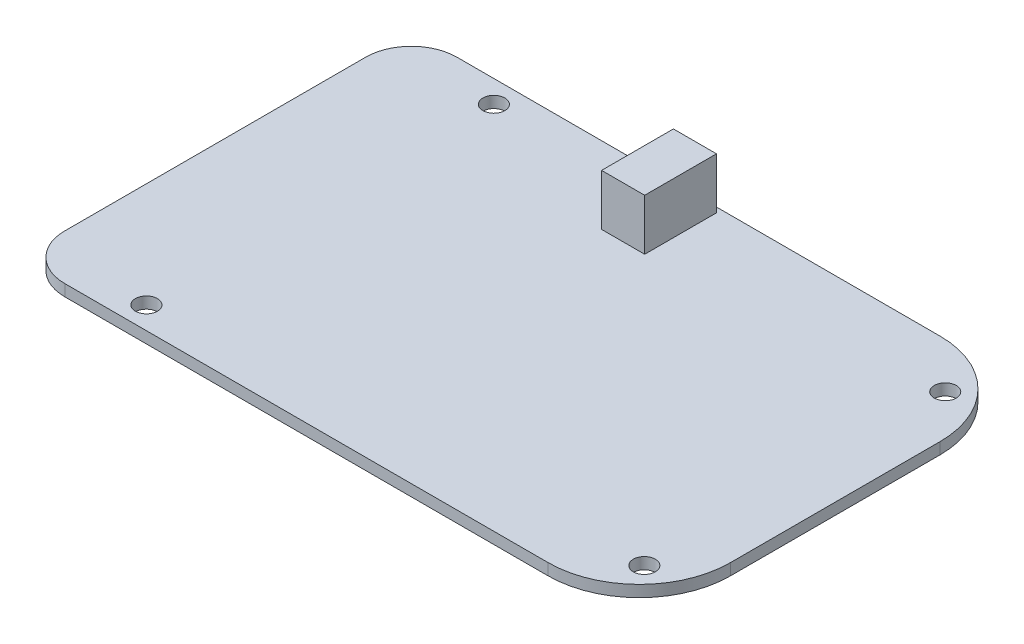
ISO-10303-21;
HEADER;
FILE_DESCRIPTION(('STEP AP214'),'2;1');
FILE_NAME('part.step','',(''),(''),'','','');
FILE_SCHEMA(('AUTOMOTIVE_DESIGN { 1 0 10303 214 1 1 1 1 }'));
ENDSEC;
DATA;
#1=APPLICATION_CONTEXT('core data for automotive mechanical design processes');
#2=APPLICATION_PROTOCOL_DEFINITION('international standard','automotive_design',2000,#1);
#3=PRODUCT_CONTEXT('',#1,'mechanical');
#4=PRODUCT('Part','Part','',(#3));
#5=PRODUCT_RELATED_PRODUCT_CATEGORY('part','',(#4));
#6=PRODUCT_DEFINITION_FORMATION('','',#4);
#7=PRODUCT_DEFINITION_CONTEXT('part definition',#1,'design');
#8=PRODUCT_DEFINITION('design','',#6,#7);
#9=PRODUCT_DEFINITION_SHAPE('','',#8);
#10=(LENGTH_UNIT() NAMED_UNIT(*) SI_UNIT(.MILLI.,.METRE.));
#11=(NAMED_UNIT(*) PLANE_ANGLE_UNIT() SI_UNIT($,.RADIAN.));
#12=(NAMED_UNIT(*) SI_UNIT($,.STERADIAN.) SOLID_ANGLE_UNIT());
#13=UNCERTAINTY_MEASURE_WITH_UNIT(LENGTH_MEASURE(1.E-05),#10,'distance_accuracy_value','');
#14=(GEOMETRIC_REPRESENTATION_CONTEXT(3) GLOBAL_UNCERTAINTY_ASSIGNED_CONTEXT((#13)) GLOBAL_UNIT_ASSIGNED_CONTEXT((#10,
#11,#12)) REPRESENTATION_CONTEXT('',''));
#15=CARTESIAN_POINT('',(0.,0.,0.));
#16=DIRECTION('',(0.,0.,1.));
#17=DIRECTION('',(1.,0.,0.));
#18=AXIS2_PLACEMENT_3D('',#15,#16,#17);
#19=CARTESIAN_POINT('',(6.35,0.,-48.26));
#20=DIRECTION('',(0.,1.,0.));
#21=DIRECTION('',(0.,0.,1.));
#22=AXIS2_PLACEMENT_3D('',#19,#20,#21);
#23=PLANE('',#22);
#24=DIRECTION('',(0.,0.,1.));
#25=VECTOR('',#24,1.);
#26=CARTESIAN_POINT('',(50.3,0.,-52.76));
#27=LINE('',#26,#25);
#28=CARTESIAN_POINT('',(50.3,0.,-52.76));
#29=VERTEX_POINT('',#28);
#30=CARTESIAN_POINT('',(50.3,0.,-46.01));
#31=VERTEX_POINT('',#30);
#32=EDGE_CURVE('E238',#29,#31,#27,.T.);
#33=ORIENTED_EDGE('',*,*,#32,.F.);
#34=DIRECTION('',(1.,0.,0.));
#35=VECTOR('',#34,1.);
#36=CARTESIAN_POINT('',(44.,0.,-52.76));
#37=LINE('',#36,#35);
#38=CARTESIAN_POINT('',(44.,0.,-52.76));
#39=VERTEX_POINT('',#38);
#40=EDGE_CURVE('E251',#39,#29,#37,.T.);
#41=ORIENTED_EDGE('',*,*,#40,.F.);
#42=DIRECTION('',(0.,0.,-1.));
#43=VECTOR('',#42,1.);
#44=CARTESIAN_POINT('',(44.,0.,-46.01));
#45=LINE('',#44,#43);
#46=CARTESIAN_POINT('',(44.,0.,-46.01));
#47=VERTEX_POINT('',#46);
#48=EDGE_CURVE('E260',#47,#39,#45,.T.);
#49=ORIENTED_EDGE('',*,*,#48,.F.);
#50=DIRECTION('',(-1.,0.,0.));
#51=VECTOR('',#50,1.);
#52=CARTESIAN_POINT('',(50.3,0.,-46.01));
#53=LINE('',#52,#51);
#54=EDGE_CURVE('E241',#31,#47,#53,.T.);
#55=ORIENTED_EDGE('',*,*,#54,.F.);
#56=EDGE_LOOP('',(#33,#41,#49,#55));
#57=FACE_BOUND('',#56,.T.);
#58=DIRECTION('',(1.,0.,0.));
#59=VECTOR('',#58,1.);
#60=CARTESIAN_POINT('',(15.3,0.,-32.));
#61=LINE('',#60,#59);
#62=CARTESIAN_POINT('',(0.,0.,-32.));
#63=VERTEX_POINT('',#62);
#64=CARTESIAN_POINT('',(15.3,0.,-32.));
#65=VERTEX_POINT('',#64);
#66=EDGE_CURVE('E314',#63,#65,#61,.T.);
#67=ORIENTED_EDGE('',*,*,#66,.F.);
#68=DIRECTION('',(0.,0.,1.));
#69=VECTOR('',#68,1.);
#70=CARTESIAN_POINT('',(0.,0.,-48.26));
#71=LINE('',#70,#69);
#72=CARTESIAN_POINT('',(0.,0.,-48.26));
#73=VERTEX_POINT('',#72);
#74=EDGE_CURVE('E415',#73,#63,#71,.T.);
#75=ORIENTED_EDGE('',*,*,#74,.F.);
#76=CARTESIAN_POINT('',(6.35,0.,-48.26));
#77=DIRECTION('',(0.,1.,0.));
#78=DIRECTION('',(0.,0.,1.));
#79=AXIS2_PLACEMENT_3D('',#76,#77,#78);
#80=CIRCLE('',#79,6.35);
#81=CARTESIAN_POINT('',(6.35,0.,-54.61));
#82=VERTEX_POINT('',#81);
#83=EDGE_CURVE('E390',#82,#73,#80,.T.);
#84=ORIENTED_EDGE('',*,*,#83,.F.);
#85=DIRECTION('',(-1.,0.,0.));
#86=VECTOR('',#85,1.);
#87=CARTESIAN_POINT('',(6.35,0.,-54.61));
#88=LINE('',#87,#86);
#89=CARTESIAN_POINT('',(73.66,0.,-54.61));
#90=VERTEX_POINT('',#89);
#91=EDGE_CURVE('E397',#90,#82,#88,.T.);
#92=ORIENTED_EDGE('',*,*,#91,.F.);
#93=CARTESIAN_POINT('',(73.66,0.,-41.91));
#94=DIRECTION('',(0.,1.,0.));
#95=DIRECTION('',(0.,0.,-1.));
#96=AXIS2_PLACEMENT_3D('',#93,#94,#95);
#97=CIRCLE('',#96,12.7);
#98=CARTESIAN_POINT('',(86.36,0.,-41.91));
#99=VERTEX_POINT('',#98);
#100=EDGE_CURVE('E426',#99,#90,#97,.T.);
#101=ORIENTED_EDGE('',*,*,#100,.F.);
#102=DIRECTION('',(0.,0.,-1.));
#103=VECTOR('',#102,1.);
#104=CARTESIAN_POINT('',(86.36,0.,-12.7));
#105=LINE('',#104,#103);
#106=CARTESIAN_POINT('',(86.36,0.,-12.7));
#107=VERTEX_POINT('',#106);
#108=EDGE_CURVE('E424',#107,#99,#105,.T.);
#109=ORIENTED_EDGE('',*,*,#108,.F.);
#110=CARTESIAN_POINT('',(73.66,0.,-12.7));
#111=DIRECTION('',(0.,1.,0.));
#112=DIRECTION('',(0.,0.,1.));
#113=AXIS2_PLACEMENT_3D('',#110,#111,#112);
#114=CIRCLE('',#113,12.7);
#115=CARTESIAN_POINT('',(73.66,0.,0.));
#116=VERTEX_POINT('',#115);
#117=EDGE_CURVE('E422',#116,#107,#114,.T.);
#118=ORIENTED_EDGE('',*,*,#117,.F.);
#119=DIRECTION('',(1.,0.,0.));
#120=VECTOR('',#119,1.);
#121=CARTESIAN_POINT('',(6.34999999999999,0.,0.));
#122=LINE('',#121,#120);
#123=CARTESIAN_POINT('',(6.34999999999999,0.,0.));
#124=VERTEX_POINT('',#123);
#125=EDGE_CURVE('E420',#124,#116,#122,.T.);
#126=ORIENTED_EDGE('',*,*,#125,.F.);
#127=CARTESIAN_POINT('',(6.34999999999999,0.,-6.35));
#128=DIRECTION('',(0.,1.,0.));
#129=DIRECTION('',(0.,0.,1.));
#130=AXIS2_PLACEMENT_3D('',#127,#128,#129);
#131=CIRCLE('',#130,6.35);
#132=CARTESIAN_POINT('',(0.,0.,-6.35));
#133=VERTEX_POINT('',#132);
#134=EDGE_CURVE('E418',#133,#124,#131,.T.);
#135=ORIENTED_EDGE('',*,*,#134,.F.);
#136=CARTESIAN_POINT('',(0.,0.,-18.));
#137=VERTEX_POINT('',#136);
#138=EDGE_CURVE('E414',#137,#133,#71,.T.);
#139=ORIENTED_EDGE('',*,*,#138,.F.);
#140=DIRECTION('',(-1.,0.,0.));
#141=VECTOR('',#140,1.);
#142=CARTESIAN_POINT('',(15.3,0.,-18.));
#143=LINE('',#142,#141);
#144=CARTESIAN_POINT('',(15.3,0.,-18.));
#145=VERTEX_POINT('',#144);
#146=EDGE_CURVE('E323',#145,#137,#143,.T.);
#147=ORIENTED_EDGE('',*,*,#146,.F.);
#148=DIRECTION('',(0.,0.,1.));
#149=VECTOR('',#148,1.);
#150=CARTESIAN_POINT('',(15.3,0.,-32.));
#151=LINE('',#150,#149);
#152=EDGE_CURVE('E309',#65,#145,#151,.T.);
#153=ORIENTED_EDGE('',*,*,#152,.F.);
#154=EDGE_LOOP('',(#67,#75,#84,#92,#101,#109,#118,#126,#135,#139,#147,#153));
#155=FACE_BOUND('',#154,.T.);
#156=CARTESIAN_POINT('',(14.61,0.,-3.10999999999999));
#157=DIRECTION('',(0.,1.,0.));
#158=DIRECTION('',(0.,0.,1.));
#159=AXIS2_PLACEMENT_3D('',#156,#157,#158);
#160=CIRCLE('',#159,1.53);
#161=CARTESIAN_POINT('',(14.61,0.,-1.57999999999999));
#162=VERTEX_POINT('',#161);
#163=EDGE_CURVE('E369',#162,#162,#160,.T.);
#164=ORIENTED_EDGE('',*,*,#163,.T.);
#165=EDGE_LOOP('',(#164));
#166=FACE_BOUND('',#165,.T.);
#167=CARTESIAN_POINT('',(14.61,0.,-51.5));
#168=DIRECTION('',(0.,1.,0.));
#169=DIRECTION('',(0.,0.,1.));
#170=AXIS2_PLACEMENT_3D('',#167,#168,#169);
#171=CIRCLE('',#170,1.53);
#172=CARTESIAN_POINT('',(14.61,0.,-49.97));
#173=VERTEX_POINT('',#172);
#174=EDGE_CURVE('E376',#173,#173,#171,.T.);
#175=ORIENTED_EDGE('',*,*,#174,.T.);
#176=EDGE_LOOP('',(#175));
#177=FACE_BOUND('',#176,.T.);
#178=CARTESIAN_POINT('',(80.71,0.,-48.26));
#179=DIRECTION('',(0.,1.,0.));
#180=DIRECTION('',(0.,0.,1.));
#181=AXIS2_PLACEMENT_3D('',#178,#179,#180);
#182=CIRCLE('',#181,1.53);
#183=CARTESIAN_POINT('',(80.71,0.,-46.73));
#184=VERTEX_POINT('',#183);
#185=EDGE_CURVE('E382',#184,#184,#182,.T.);
#186=ORIENTED_EDGE('',*,*,#185,.T.);
#187=EDGE_LOOP('',(#186));
#188=FACE_BOUND('',#187,.T.);
#189=CARTESIAN_POINT('',(80.71,0.,-6.35));
#190=DIRECTION('',(0.,1.,0.));
#191=DIRECTION('',(0.,0.,1.));
#192=AXIS2_PLACEMENT_3D('',#189,#190,#191);
#193=CIRCLE('',#192,1.53);
#194=CARTESIAN_POINT('',(80.71,0.,-4.82));
#195=VERTEX_POINT('',#194);
#196=EDGE_CURVE('E387',#195,#195,#193,.T.);
#197=ORIENTED_EDGE('',*,*,#196,.T.);
#198=EDGE_LOOP('',(#197));
#199=FACE_BOUND('',#198,.T.);
#200=DIRECTION('',(-1.,0.,0.));
#201=VECTOR('',#200,1.);
#202=CARTESIAN_POINT('',(19.3,0.,-43.61));
#203=LINE('',#202,#201);
#204=CARTESIAN_POINT('',(25.3,0.,-43.61));
#205=VERTEX_POINT('',#204);
#206=CARTESIAN_POINT('',(19.3,0.,-43.61));
#207=VERTEX_POINT('',#206);
#208=EDGE_CURVE('E276',#205,#207,#203,.T.);
#209=ORIENTED_EDGE('',*,*,#208,.F.);
#210=DIRECTION('',(0.,0.,1.));
#211=VECTOR('',#210,1.);
#212=CARTESIAN_POINT('',(25.3,0.,-43.61));
#213=LINE('',#212,#211);
#214=CARTESIAN_POINT('',(25.3,0.,-50.61));
#215=VERTEX_POINT('',#214);
#216=EDGE_CURVE('E281',#215,#205,#213,.T.);
#217=ORIENTED_EDGE('',*,*,#216,.F.);
#218=DIRECTION('',(1.,0.,0.));
#219=VECTOR('',#218,1.);
#220=CARTESIAN_POINT('',(25.3,0.,-50.61));
#221=LINE('',#220,#219);
#222=CARTESIAN_POINT('',(19.3,0.,-50.61));
#223=VERTEX_POINT('',#222);
#224=EDGE_CURVE('E293',#223,#215,#221,.T.);
#225=ORIENTED_EDGE('',*,*,#224,.F.);
#226=DIRECTION('',(0.,0.,-1.));
#227=VECTOR('',#226,1.);
#228=CARTESIAN_POINT('',(19.3,0.,-50.61));
#229=LINE('',#228,#227);
#230=EDGE_CURVE('E290',#207,#223,#229,.T.);
#231=ORIENTED_EDGE('',*,*,#230,.F.);
#232=EDGE_LOOP('',(#209,#217,#225,#231));
#233=FACE_BOUND('',#232,.T.);
#234=DIRECTION('',(0.,0.,-1.));
#235=VECTOR('',#234,1.);
#236=CARTESIAN_POINT('',(57.36,0.,-44.41));
#237=LINE('',#236,#235);
#238=CARTESIAN_POINT('',(57.36,0.,-44.41));
#239=VERTEX_POINT('',#238);
#240=CARTESIAN_POINT('',(57.36,0.,-52.91));
#241=VERTEX_POINT('',#240);
#242=EDGE_CURVE('E237',#239,#241,#237,.T.);
#243=ORIENTED_EDGE('',*,*,#242,.F.);
#244=DIRECTION('',(-1.,0.,0.));
#245=VECTOR('',#244,1.);
#246=CARTESIAN_POINT('',(65.86,0.,-44.41));
#247=LINE('',#246,#245);
#248=CARTESIAN_POINT('',(65.86,0.,-44.41));
#249=VERTEX_POINT('',#248);
#250=EDGE_CURVE('E234',#249,#239,#247,.T.);
#251=ORIENTED_EDGE('',*,*,#250,.F.);
#252=DIRECTION('',(0.,0.,1.));
#253=VECTOR('',#252,1.);
#254=CARTESIAN_POINT('',(65.86,0.,-52.91));
#255=LINE('',#254,#253);
#256=CARTESIAN_POINT('',(65.86,0.,-52.91));
#257=VERTEX_POINT('',#256);
#258=EDGE_CURVE('E52',#257,#249,#255,.T.);
#259=ORIENTED_EDGE('',*,*,#258,.F.);
#260=DIRECTION('',(1.,0.,0.));
#261=VECTOR('',#260,1.);
#262=CARTESIAN_POINT('',(57.36,0.,-52.91));
#263=LINE('',#262,#261);
#264=EDGE_CURVE('E47',#241,#257,#263,.T.);
#265=ORIENTED_EDGE('',*,*,#264,.F.);
#266=EDGE_LOOP('',(#243,#251,#259,#265));
#267=FACE_BOUND('',#266,.T.);
#268=ADVANCED_FACE('F32',(#57,#155,#166,#177,#188,#199,#233,#267),#23,.F.);
#269=CARTESIAN_POINT('',(6.35,1.6,-48.26));
#270=DIRECTION('',(0.,1.,0.));
#271=DIRECTION('',(0.,0.,1.));
#272=AXIS2_PLACEMENT_3D('',#269,#270,#271);
#273=PLANE('',#272);
#274=CARTESIAN_POINT('',(14.61,1.6,-3.10999999999999));
#275=DIRECTION('',(0.,1.,0.));
#276=DIRECTION('',(0.,0.,1.));
#277=AXIS2_PLACEMENT_3D('',#274,#275,#276);
#278=CIRCLE('',#277,1.53);
#279=CARTESIAN_POINT('',(14.61,1.6,-1.57999999999999));
#280=VERTEX_POINT('',#279);
#281=EDGE_CURVE('E373',#280,#280,#278,.T.);
#282=ORIENTED_EDGE('',*,*,#281,.F.);
#283=EDGE_LOOP('',(#282));
#284=FACE_BOUND('',#283,.T.);
#285=CARTESIAN_POINT('',(14.61,1.6,-51.5));
#286=DIRECTION('',(0.,1.,0.));
#287=DIRECTION('',(0.,0.,1.));
#288=AXIS2_PLACEMENT_3D('',#285,#286,#287);
#289=CIRCLE('',#288,1.53);
#290=CARTESIAN_POINT('',(14.61,1.6,-49.97));
#291=VERTEX_POINT('',#290);
#292=EDGE_CURVE('E379',#291,#291,#289,.T.);
#293=ORIENTED_EDGE('',*,*,#292,.F.);
#294=EDGE_LOOP('',(#293));
#295=FACE_BOUND('',#294,.T.);
#296=CARTESIAN_POINT('',(80.71,1.6,-48.26));
#297=DIRECTION('',(0.,1.,0.));
#298=DIRECTION('',(0.,0.,1.));
#299=AXIS2_PLACEMENT_3D('',#296,#297,#298);
#300=CIRCLE('',#299,1.53);
#301=CARTESIAN_POINT('',(80.71,1.6,-46.73));
#302=VERTEX_POINT('',#301);
#303=EDGE_CURVE('E368',#302,#302,#300,.T.);
#304=ORIENTED_EDGE('',*,*,#303,.F.);
#305=EDGE_LOOP('',(#304));
#306=FACE_BOUND('',#305,.T.);
#307=CARTESIAN_POINT('',(80.71,1.6,-6.35));
#308=DIRECTION('',(0.,1.,0.));
#309=DIRECTION('',(0.,0.,1.));
#310=AXIS2_PLACEMENT_3D('',#307,#308,#309);
#311=CIRCLE('',#310,1.53);
#312=CARTESIAN_POINT('',(80.71,1.6,-4.82));
#313=VERTEX_POINT('',#312);
#314=EDGE_CURVE('E372',#313,#313,#311,.T.);
#315=ORIENTED_EDGE('',*,*,#314,.F.);
#316=EDGE_LOOP('',(#315));
#317=FACE_BOUND('',#316,.T.);
#318=CARTESIAN_POINT('',(6.35,1.6,-48.26));
#319=DIRECTION('',(0.,1.,0.));
#320=DIRECTION('',(0.,0.,1.));
#321=AXIS2_PLACEMENT_3D('',#318,#319,#320);
#322=CIRCLE('',#321,6.35);
#323=CARTESIAN_POINT('',(6.35,1.6,-54.61));
#324=VERTEX_POINT('',#323);
#325=CARTESIAN_POINT('',(0.,1.6,-48.26));
#326=VERTEX_POINT('',#325);
#327=EDGE_CURVE('E393',#324,#326,#322,.T.);
#328=ORIENTED_EDGE('',*,*,#327,.T.);
#329=DIRECTION('',(0.,0.,1.));
#330=VECTOR('',#329,1.);
#331=CARTESIAN_POINT('',(0.,1.6,-48.26));
#332=LINE('',#331,#330);
#333=CARTESIAN_POINT('',(0.,1.6,-6.35));
#334=VERTEX_POINT('',#333);
#335=EDGE_CURVE('E396',#326,#334,#332,.T.);
#336=ORIENTED_EDGE('',*,*,#335,.T.);
#337=CARTESIAN_POINT('',(6.34999999999999,1.6,-6.35));
#338=DIRECTION('',(0.,1.,0.));
#339=DIRECTION('',(0.,0.,1.));
#340=AXIS2_PLACEMENT_3D('',#337,#338,#339);
#341=CIRCLE('',#340,6.35);
#342=CARTESIAN_POINT('',(6.34999999999999,1.6,0.));
#343=VERTEX_POINT('',#342);
#344=EDGE_CURVE('E399',#334,#343,#341,.T.);
#345=ORIENTED_EDGE('',*,*,#344,.T.);
#346=DIRECTION('',(1.,0.,0.));
#347=VECTOR('',#346,1.);
#348=CARTESIAN_POINT('',(6.34999999999999,1.6,0.));
#349=LINE('',#348,#347);
#350=CARTESIAN_POINT('',(73.66,1.6,0.));
#351=VERTEX_POINT('',#350);
#352=EDGE_CURVE('E401',#343,#351,#349,.T.);
#353=ORIENTED_EDGE('',*,*,#352,.T.);
#354=CARTESIAN_POINT('',(73.66,1.6,-12.7));
#355=DIRECTION('',(0.,1.,0.));
#356=DIRECTION('',(0.,0.,1.));
#357=AXIS2_PLACEMENT_3D('',#354,#355,#356);
#358=CIRCLE('',#357,12.7);
#359=CARTESIAN_POINT('',(86.36,1.6,-12.7));
#360=VERTEX_POINT('',#359);
#361=EDGE_CURVE('E403',#351,#360,#358,.T.);
#362=ORIENTED_EDGE('',*,*,#361,.T.);
#363=DIRECTION('',(0.,0.,-1.));
#364=VECTOR('',#363,1.);
#365=CARTESIAN_POINT('',(86.36,1.6,-12.7));
#366=LINE('',#365,#364);
#367=CARTESIAN_POINT('',(86.36,1.6,-41.91));
#368=VERTEX_POINT('',#367);
#369=EDGE_CURVE('E405',#360,#368,#366,.T.);
#370=ORIENTED_EDGE('',*,*,#369,.T.);
#371=CARTESIAN_POINT('',(73.66,1.6,-41.91));
#372=DIRECTION('',(0.,1.,0.));
#373=DIRECTION('',(0.,0.,-1.));
#374=AXIS2_PLACEMENT_3D('',#371,#372,#373);
#375=CIRCLE('',#374,12.7);
#376=CARTESIAN_POINT('',(73.66,1.6,-54.61));
#377=VERTEX_POINT('',#376);
#378=EDGE_CURVE('E407',#368,#377,#375,.T.);
#379=ORIENTED_EDGE('',*,*,#378,.T.);
#380=DIRECTION('',(-1.,0.,0.));
#381=VECTOR('',#380,1.);
#382=CARTESIAN_POINT('',(6.35,1.6,-54.61));
#383=LINE('',#382,#381);
#384=EDGE_CURVE('E409',#377,#324,#383,.T.);
#385=ORIENTED_EDGE('',*,*,#384,.T.);
#386=EDGE_LOOP('',(#328,#336,#345,#353,#362,#370,#379,#385));
#387=FACE_BOUND('',#386,.T.);
#388=DIRECTION('',(1.,0.,0.));
#389=VECTOR('',#388,1.);
#390=CARTESIAN_POINT('',(37.2,1.6,-43.91));
#391=LINE('',#390,#389);
#392=CARTESIAN_POINT('',(37.2,1.6,-43.91));
#393=VERTEX_POINT('',#392);
#394=CARTESIAN_POINT('',(43.2,1.6,-43.91));
#395=VERTEX_POINT('',#394);
#396=EDGE_CURVE('E353',#393,#395,#391,.T.);
#397=ORIENTED_EDGE('',*,*,#396,.F.);
#398=DIRECTION('',(0.,0.,1.));
#399=VECTOR('',#398,1.);
#400=CARTESIAN_POINT('',(37.2,1.6,-53.91));
#401=LINE('',#400,#399);
#402=CARTESIAN_POINT('',(37.2,1.6,-53.91));
#403=VERTEX_POINT('',#402);
#404=EDGE_CURVE('E339',#403,#393,#401,.T.);
#405=ORIENTED_EDGE('',*,*,#404,.F.);
#406=DIRECTION('',(-1.,0.,0.));
#407=VECTOR('',#406,1.);
#408=CARTESIAN_POINT('',(43.2,1.6,-53.91));
#409=LINE('',#408,#407);
#410=CARTESIAN_POINT('',(43.2,1.6,-53.91));
#411=VERTEX_POINT('',#410);
#412=EDGE_CURVE('E344',#411,#403,#409,.T.);
#413=ORIENTED_EDGE('',*,*,#412,.F.);
#414=DIRECTION('',(0.,0.,-1.));
#415=VECTOR('',#414,1.);
#416=CARTESIAN_POINT('',(43.2,1.6,-43.91));
#417=LINE('',#416,#415);
#418=EDGE_CURVE('E355',#395,#411,#417,.T.);
#419=ORIENTED_EDGE('',*,*,#418,.F.);
#420=EDGE_LOOP('',(#397,#405,#413,#419));
#421=FACE_BOUND('',#420,.T.);
#422=ADVANCED_FACE('F468',(#284,#295,#306,#317,#387,#421),#273,.T.);
#423=CARTESIAN_POINT('',(6.35,1.6,-48.26));
#424=DIRECTION('',(0.,-1.,0.));
#425=DIRECTION('',(0.,0.,-1.));
#426=AXIS2_PLACEMENT_3D('',#423,#424,#425);
#427=CYLINDRICAL_SURFACE('',#426,6.35);
#428=ORIENTED_EDGE('',*,*,#83,.T.);
#429=DIRECTION('',(0.,-1.,0.));
#430=VECTOR('',#429,1.);
#431=CARTESIAN_POINT('',(0.,1.6,-48.26));
#432=LINE('',#431,#430);
#433=EDGE_CURVE('E11',#326,#73,#432,.T.);
#434=ORIENTED_EDGE('',*,*,#433,.F.);
#435=ORIENTED_EDGE('',*,*,#327,.F.);
#436=DIRECTION('',(0.,-1.,0.));
#437=VECTOR('',#436,1.);
#438=CARTESIAN_POINT('',(6.35,1.6,-54.61));
#439=LINE('',#438,#437);
#440=EDGE_CURVE('E411',#324,#82,#439,.T.);
#441=ORIENTED_EDGE('',*,*,#440,.T.);
#442=EDGE_LOOP('',(#428,#434,#435,#441));
#443=FACE_BOUND('',#442,.T.);
#444=ADVANCED_FACE('F34',(#443),#427,.T.);
#445=CARTESIAN_POINT('',(0.,1.6,-48.26));
#446=DIRECTION('',(1.,0.,0.));
#447=DIRECTION('',(0.,0.,-1.));
#448=AXIS2_PLACEMENT_3D('',#445,#446,#447);
#449=PLANE('',#448);
#450=ORIENTED_EDGE('',*,*,#74,.T.);
#451=DIRECTION('',(0.,1.,0.));
#452=VECTOR('',#451,1.);
#453=CARTESIAN_POINT('',(0.,-1.7,-32.));
#454=LINE('',#453,#452);
#455=CARTESIAN_POINT('',(0.,-1.7,-32.));
#456=VERTEX_POINT('',#455);
#457=EDGE_CURVE('E330',#456,#63,#454,.T.);
#458=ORIENTED_EDGE('',*,*,#457,.F.);
#459=DIRECTION('',(0.,0.,-1.));
#460=VECTOR('',#459,1.);
#461=CARTESIAN_POINT('',(0.,-1.7,-18.));
#462=LINE('',#461,#460);
#463=CARTESIAN_POINT('',(0.,-1.7,-18.));
#464=VERTEX_POINT('',#463);
#465=EDGE_CURVE('E316',#464,#456,#462,.T.);
#466=ORIENTED_EDGE('',*,*,#465,.F.);
#467=DIRECTION('',(0.,1.,0.));
#468=VECTOR('',#467,1.);
#469=CARTESIAN_POINT('',(0.,-1.7,-18.));
#470=LINE('',#469,#468);
#471=EDGE_CURVE('E333',#464,#137,#470,.T.);
#472=ORIENTED_EDGE('',*,*,#471,.T.);
#473=ORIENTED_EDGE('',*,*,#138,.T.);
#474=DIRECTION('',(0.,-1.,0.));
#475=VECTOR('',#474,1.);
#476=CARTESIAN_POINT('',(0.,1.6,-6.35));
#477=LINE('',#476,#475);
#478=EDGE_CURVE('E40',#334,#133,#477,.T.);
#479=ORIENTED_EDGE('',*,*,#478,.F.);
#480=ORIENTED_EDGE('',*,*,#335,.F.);
#481=ORIENTED_EDGE('',*,*,#433,.T.);
#482=EDGE_LOOP('',(#450,#458,#466,#472,#473,#479,#480,#481));
#483=FACE_BOUND('',#482,.T.);
#484=ADVANCED_FACE('F473',(#483),#449,.F.);
#485=CARTESIAN_POINT('',(6.34999999999999,1.6,-6.35));
#486=DIRECTION('',(0.,-1.,0.));
#487=DIRECTION('',(0.,0.,-1.));
#488=AXIS2_PLACEMENT_3D('',#485,#486,#487);
#489=CYLINDRICAL_SURFACE('',#488,6.35);
#490=ORIENTED_EDGE('',*,*,#134,.T.);
#491=DIRECTION('',(0.,-1.,0.));
#492=VECTOR('',#491,1.);
#493=CARTESIAN_POINT('',(6.34999999999999,1.6,0.));
#494=LINE('',#493,#492);
#495=EDGE_CURVE('E443',#343,#124,#494,.T.);
#496=ORIENTED_EDGE('',*,*,#495,.F.);
#497=ORIENTED_EDGE('',*,*,#344,.F.);
#498=ORIENTED_EDGE('',*,*,#478,.T.);
#499=EDGE_LOOP('',(#490,#496,#497,#498));
#500=FACE_BOUND('',#499,.T.);
#501=ADVANCED_FACE('F450',(#500),#489,.T.);
#502=CARTESIAN_POINT('',(6.34999999999999,1.6,0.));
#503=DIRECTION('',(0.,0.,-1.));
#504=DIRECTION('',(-1.,0.,0.));
#505=AXIS2_PLACEMENT_3D('',#502,#503,#504);
#506=PLANE('',#505);
#507=ORIENTED_EDGE('',*,*,#125,.T.);
#508=DIRECTION('',(0.,-1.,0.));
#509=VECTOR('',#508,1.);
#510=CARTESIAN_POINT('',(73.66,1.6,0.));
#511=LINE('',#510,#509);
#512=EDGE_CURVE('E440',#351,#116,#511,.T.);
#513=ORIENTED_EDGE('',*,*,#512,.F.);
#514=ORIENTED_EDGE('',*,*,#352,.F.);
#515=ORIENTED_EDGE('',*,*,#495,.T.);
#516=EDGE_LOOP('',(#507,#513,#514,#515));
#517=FACE_BOUND('',#516,.T.);
#518=ADVANCED_FACE('F460',(#517),#506,.F.);
#519=CARTESIAN_POINT('',(73.66,1.6,-12.7));
#520=DIRECTION('',(0.,-1.,0.));
#521=DIRECTION('',(0.,0.,-1.));
#522=AXIS2_PLACEMENT_3D('',#519,#520,#521);
#523=CYLINDRICAL_SURFACE('',#522,12.7);
#524=ORIENTED_EDGE('',*,*,#117,.T.);
#525=DIRECTION('',(0.,-1.,0.));
#526=VECTOR('',#525,1.);
#527=CARTESIAN_POINT('',(86.36,1.6,-12.7));
#528=LINE('',#527,#526);
#529=EDGE_CURVE('E437',#360,#107,#528,.T.);
#530=ORIENTED_EDGE('',*,*,#529,.F.);
#531=ORIENTED_EDGE('',*,*,#361,.F.);
#532=ORIENTED_EDGE('',*,*,#512,.T.);
#533=EDGE_LOOP('',(#524,#530,#531,#532));
#534=FACE_BOUND('',#533,.T.);
#535=ADVANCED_FACE('F464',(#534),#523,.T.);
#536=CARTESIAN_POINT('',(86.36,1.6,-12.7));
#537=DIRECTION('',(-1.,0.,0.));
#538=DIRECTION('',(0.,0.,1.));
#539=AXIS2_PLACEMENT_3D('',#536,#537,#538);
#540=PLANE('',#539);
#541=ORIENTED_EDGE('',*,*,#108,.T.);
#542=DIRECTION('',(0.,-1.,0.));
#543=VECTOR('',#542,1.);
#544=CARTESIAN_POINT('',(86.36,1.6,-41.91));
#545=LINE('',#544,#543);
#546=EDGE_CURVE('E434',#368,#99,#545,.T.);
#547=ORIENTED_EDGE('',*,*,#546,.F.);
#548=ORIENTED_EDGE('',*,*,#369,.F.);
#549=ORIENTED_EDGE('',*,*,#529,.T.);
#550=EDGE_LOOP('',(#541,#547,#548,#549));
#551=FACE_BOUND('',#550,.T.);
#552=ADVANCED_FACE('F521',(#551),#540,.F.);
#553=CARTESIAN_POINT('',(73.66,1.6,-41.91));
#554=DIRECTION('',(0.,-1.,0.));
#555=DIRECTION('',(0.,0.,-1.));
#556=AXIS2_PLACEMENT_3D('',#553,#554,#555);
#557=CYLINDRICAL_SURFACE('',#556,12.7);
#558=ORIENTED_EDGE('',*,*,#100,.T.);
#559=DIRECTION('',(0.,-1.,0.));
#560=VECTOR('',#559,1.);
#561=CARTESIAN_POINT('',(73.66,1.6,-54.61));
#562=LINE('',#561,#560);
#563=EDGE_CURVE('E431',#377,#90,#562,.T.);
#564=ORIENTED_EDGE('',*,*,#563,.F.);
#565=ORIENTED_EDGE('',*,*,#378,.F.);
#566=ORIENTED_EDGE('',*,*,#546,.T.);
#567=EDGE_LOOP('',(#558,#564,#565,#566));
#568=FACE_BOUND('',#567,.T.);
#569=ADVANCED_FACE('F517',(#568),#557,.T.);
#570=CARTESIAN_POINT('',(6.35,1.6,-54.61));
#571=DIRECTION('',(0.,0.,1.));
#572=DIRECTION('',(1.,0.,0.));
#573=AXIS2_PLACEMENT_3D('',#570,#571,#572);
#574=PLANE('',#573);
#575=ORIENTED_EDGE('',*,*,#91,.T.);
#576=ORIENTED_EDGE('',*,*,#440,.F.);
#577=ORIENTED_EDGE('',*,*,#384,.F.);
#578=ORIENTED_EDGE('',*,*,#563,.T.);
#579=EDGE_LOOP('',(#575,#576,#577,#578));
#580=FACE_BOUND('',#579,.T.);
#581=ADVANCED_FACE('F513',(#580),#574,.F.);
#582=CARTESIAN_POINT('',(80.71,0.,-6.35));
#583=DIRECTION('',(0.,1.,0.));
#584=DIRECTION('',(0.,0.,1.));
#585=AXIS2_PLACEMENT_3D('',#582,#583,#584);
#586=CYLINDRICAL_SURFACE('',#585,1.53);
#587=ORIENTED_EDGE('',*,*,#196,.F.);
#588=EDGE_LOOP('',(#587));
#589=FACE_BOUND('',#588,.T.);
#590=ORIENTED_EDGE('',*,*,#314,.T.);
#591=EDGE_LOOP('',(#590));
#592=FACE_BOUND('',#591,.T.);
#593=ADVANCED_FACE('F516',(#589,#592),#586,.F.);
#594=CARTESIAN_POINT('',(80.71,0.,-48.26));
#595=DIRECTION('',(0.,1.,0.));
#596=DIRECTION('',(0.,0.,1.));
#597=AXIS2_PLACEMENT_3D('',#594,#595,#596);
#598=CYLINDRICAL_SURFACE('',#597,1.53);
#599=ORIENTED_EDGE('',*,*,#185,.F.);
#600=EDGE_LOOP('',(#599));
#601=FACE_BOUND('',#600,.T.);
#602=ORIENTED_EDGE('',*,*,#303,.T.);
#603=EDGE_LOOP('',(#602));
#604=FACE_BOUND('',#603,.T.);
#605=ADVANCED_FACE('F843',(#601,#604),#598,.F.);
#606=CARTESIAN_POINT('',(14.61,0.,-51.5));
#607=DIRECTION('',(0.,1.,0.));
#608=DIRECTION('',(0.,0.,1.));
#609=AXIS2_PLACEMENT_3D('',#606,#607,#608);
#610=CYLINDRICAL_SURFACE('',#609,1.53);
#611=ORIENTED_EDGE('',*,*,#174,.F.);
#612=EDGE_LOOP('',(#611));
#613=FACE_BOUND('',#612,.T.);
#614=ORIENTED_EDGE('',*,*,#292,.T.);
#615=EDGE_LOOP('',(#614));
#616=FACE_BOUND('',#615,.T.);
#617=ADVANCED_FACE('F851',(#613,#616),#610,.F.);
#618=CARTESIAN_POINT('',(14.61,0.,-3.10999999999999));
#619=DIRECTION('',(0.,1.,0.));
#620=DIRECTION('',(0.,0.,1.));
#621=AXIS2_PLACEMENT_3D('',#618,#619,#620);
#622=CYLINDRICAL_SURFACE('',#621,1.53);
#623=ORIENTED_EDGE('',*,*,#163,.F.);
#624=EDGE_LOOP('',(#623));
#625=FACE_BOUND('',#624,.T.);
#626=ORIENTED_EDGE('',*,*,#281,.T.);
#627=EDGE_LOOP('',(#626));
#628=FACE_BOUND('',#627,.T.);
#629=ADVANCED_FACE('F550',(#625,#628),#622,.F.);
#630=CARTESIAN_POINT('',(37.2,8.72,-53.91));
#631=DIRECTION('',(1.,0.,0.));
#632=DIRECTION('',(0.,0.,-1.));
#633=AXIS2_PLACEMENT_3D('',#630,#631,#632);
#634=PLANE('',#633);
#635=ORIENTED_EDGE('',*,*,#404,.T.);
#636=DIRECTION('',(0.,-1.,0.));
#637=VECTOR('',#636,1.);
#638=CARTESIAN_POINT('',(37.2,8.72,-43.91));
#639=LINE('',#638,#637);
#640=CARTESIAN_POINT('',(37.2,8.72,-43.91));
#641=VERTEX_POINT('',#640);
#642=EDGE_CURVE('E366',#641,#393,#639,.T.);
#643=ORIENTED_EDGE('',*,*,#642,.F.);
#644=DIRECTION('',(0.,0.,1.));
#645=VECTOR('',#644,1.);
#646=CARTESIAN_POINT('',(37.2,8.72,-53.91));
#647=LINE('',#646,#645);
#648=CARTESIAN_POINT('',(37.2,8.72,-53.91));
#649=VERTEX_POINT('',#648);
#650=EDGE_CURVE('E340',#649,#641,#647,.T.);
#651=ORIENTED_EDGE('',*,*,#650,.F.);
#652=DIRECTION('',(0.,-1.,0.));
#653=VECTOR('',#652,1.);
#654=CARTESIAN_POINT('',(37.2,8.72,-53.91));
#655=LINE('',#654,#653);
#656=EDGE_CURVE('E350',#649,#403,#655,.T.);
#657=ORIENTED_EDGE('',*,*,#656,.T.);
#658=EDGE_LOOP('',(#635,#643,#651,#657));
#659=FACE_BOUND('',#658,.T.);
#660=ADVANCED_FACE('F554',(#659),#634,.F.);
#661=CARTESIAN_POINT('',(37.2,8.72,-43.91));
#662=DIRECTION('',(0.,0.,-1.));
#663=DIRECTION('',(-1.,0.,0.));
#664=AXIS2_PLACEMENT_3D('',#661,#662,#663);
#665=PLANE('',#664);
#666=ORIENTED_EDGE('',*,*,#396,.T.);
#667=DIRECTION('',(0.,-1.,0.));
#668=VECTOR('',#667,1.);
#669=CARTESIAN_POINT('',(43.2,8.72,-43.91));
#670=LINE('',#669,#668);
#671=CARTESIAN_POINT('',(43.2,8.72,-43.91));
#672=VERTEX_POINT('',#671);
#673=EDGE_CURVE('E363',#672,#395,#670,.T.);
#674=ORIENTED_EDGE('',*,*,#673,.F.);
#675=DIRECTION('',(1.,0.,0.));
#676=VECTOR('',#675,1.);
#677=CARTESIAN_POINT('',(37.2,8.72,-43.91));
#678=LINE('',#677,#676);
#679=EDGE_CURVE('E343',#641,#672,#678,.T.);
#680=ORIENTED_EDGE('',*,*,#679,.F.);
#681=ORIENTED_EDGE('',*,*,#642,.T.);
#682=EDGE_LOOP('',(#666,#674,#680,#681));
#683=FACE_BOUND('',#682,.T.);
#684=ADVANCED_FACE('F558',(#683),#665,.F.);
#685=CARTESIAN_POINT('',(43.2,8.72,-43.91));
#686=DIRECTION('',(-1.,0.,0.));
#687=DIRECTION('',(0.,0.,1.));
#688=AXIS2_PLACEMENT_3D('',#685,#686,#687);
#689=PLANE('',#688);
#690=ORIENTED_EDGE('',*,*,#418,.T.);
#691=DIRECTION('',(0.,-1.,0.));
#692=VECTOR('',#691,1.);
#693=CARTESIAN_POINT('',(43.2,8.72,-53.91));
#694=LINE('',#693,#692);
#695=CARTESIAN_POINT('',(43.2,8.72,-53.91));
#696=VERTEX_POINT('',#695);
#697=EDGE_CURVE('E361',#696,#411,#694,.T.);
#698=ORIENTED_EDGE('',*,*,#697,.F.);
#699=DIRECTION('',(0.,0.,-1.));
#700=VECTOR('',#699,1.);
#701=CARTESIAN_POINT('',(43.2,8.72,-43.91));
#702=LINE('',#701,#700);
#703=EDGE_CURVE('E346',#672,#696,#702,.T.);
#704=ORIENTED_EDGE('',*,*,#703,.F.);
#705=ORIENTED_EDGE('',*,*,#673,.T.);
#706=EDGE_LOOP('',(#690,#698,#704,#705));
#707=FACE_BOUND('',#706,.T.);
#708=ADVANCED_FACE('F568',(#707),#689,.F.);
#709=CARTESIAN_POINT('',(43.2,8.72,-53.91));
#710=DIRECTION('',(0.,0.,1.));
#711=DIRECTION('',(1.,0.,0.));
#712=AXIS2_PLACEMENT_3D('',#709,#710,#711);
#713=PLANE('',#712);
#714=ORIENTED_EDGE('',*,*,#412,.T.);
#715=ORIENTED_EDGE('',*,*,#656,.F.);
#716=DIRECTION('',(-1.,0.,0.));
#717=VECTOR('',#716,1.);
#718=CARTESIAN_POINT('',(43.2,8.72,-53.91));
#719=LINE('',#718,#717);
#720=EDGE_CURVE('E348',#696,#649,#719,.T.);
#721=ORIENTED_EDGE('',*,*,#720,.F.);
#722=ORIENTED_EDGE('',*,*,#697,.T.);
#723=EDGE_LOOP('',(#714,#715,#721,#722));
#724=FACE_BOUND('',#723,.T.);
#725=ADVANCED_FACE('F578',(#724),#713,.F.);
#726=CARTESIAN_POINT('',(0.,8.72,0.));
#727=DIRECTION('',(0.,1.,0.));
#728=DIRECTION('',(0.,0.,1.));
#729=AXIS2_PLACEMENT_3D('',#726,#727,#728);
#730=PLANE('',#729);
#731=ORIENTED_EDGE('',*,*,#650,.T.);
#732=ORIENTED_EDGE('',*,*,#679,.T.);
#733=ORIENTED_EDGE('',*,*,#703,.T.);
#734=ORIENTED_EDGE('',*,*,#720,.T.);
#735=EDGE_LOOP('',(#731,#732,#733,#734));
#736=FACE_BOUND('',#735,.T.);
#737=ADVANCED_FACE('F501',(#736),#730,.T.);
#738=CARTESIAN_POINT('',(15.3,-1.7,-32.));
#739=DIRECTION('',(-1.,0.,0.));
#740=DIRECTION('',(0.,0.,1.));
#741=AXIS2_PLACEMENT_3D('',#738,#739,#740);
#742=PLANE('',#741);
#743=ORIENTED_EDGE('',*,*,#152,.T.);
#744=DIRECTION('',(0.,1.,0.));
#745=VECTOR('',#744,1.);
#746=CARTESIAN_POINT('',(15.3,-1.7,-18.));
#747=LINE('',#746,#745);
#748=CARTESIAN_POINT('',(15.3,-1.7,-18.));
#749=VERTEX_POINT('',#748);
#750=EDGE_CURVE('E336',#749,#145,#747,.T.);
#751=ORIENTED_EDGE('',*,*,#750,.F.);
#752=DIRECTION('',(0.,0.,1.));
#753=VECTOR('',#752,1.);
#754=CARTESIAN_POINT('',(15.3,-1.7,-32.));
#755=LINE('',#754,#753);
#756=CARTESIAN_POINT('',(15.3,-1.7,-32.));
#757=VERTEX_POINT('',#756);
#758=EDGE_CURVE('E310',#757,#749,#755,.T.);
#759=ORIENTED_EDGE('',*,*,#758,.F.);
#760=DIRECTION('',(0.,1.,0.));
#761=VECTOR('',#760,1.);
#762=CARTESIAN_POINT('',(15.3,-1.7,-32.));
#763=LINE('',#762,#761);
#764=EDGE_CURVE('E320',#757,#65,#763,.T.);
#765=ORIENTED_EDGE('',*,*,#764,.T.);
#766=EDGE_LOOP('',(#743,#751,#759,#765));
#767=FACE_BOUND('',#766,.T.);
#768=ADVANCED_FACE('F486',(#767),#742,.F.);
#769=CARTESIAN_POINT('',(15.3,-1.7,-18.));
#770=DIRECTION('',(0.,0.,-1.));
#771=DIRECTION('',(-1.,0.,0.));
#772=AXIS2_PLACEMENT_3D('',#769,#770,#771);
#773=PLANE('',#772);
#774=ORIENTED_EDGE('',*,*,#146,.T.);
#775=ORIENTED_EDGE('',*,*,#471,.F.);
#776=DIRECTION('',(-1.,0.,0.));
#777=VECTOR('',#776,1.);
#778=CARTESIAN_POINT('',(15.3,-1.7,-18.));
#779=LINE('',#778,#777);
#780=EDGE_CURVE('E313',#749,#464,#779,.T.);
#781=ORIENTED_EDGE('',*,*,#780,.F.);
#782=ORIENTED_EDGE('',*,*,#750,.T.);
#783=EDGE_LOOP('',(#774,#775,#781,#782));
#784=FACE_BOUND('',#783,.T.);
#785=ADVANCED_FACE('F493',(#784),#773,.F.);
#786=CARTESIAN_POINT('',(15.3,-1.7,-32.));
#787=DIRECTION('',(0.,0.,1.));
#788=DIRECTION('',(1.,0.,0.));
#789=AXIS2_PLACEMENT_3D('',#786,#787,#788);
#790=PLANE('',#789);
#791=ORIENTED_EDGE('',*,*,#66,.T.);
#792=ORIENTED_EDGE('',*,*,#764,.F.);
#793=DIRECTION('',(1.,0.,0.));
#794=VECTOR('',#793,1.);
#795=CARTESIAN_POINT('',(15.3,-1.7,-32.));
#796=LINE('',#795,#794);
#797=EDGE_CURVE('E318',#456,#757,#796,.T.);
#798=ORIENTED_EDGE('',*,*,#797,.F.);
#799=ORIENTED_EDGE('',*,*,#457,.T.);
#800=EDGE_LOOP('',(#791,#792,#798,#799));
#801=FACE_BOUND('',#800,.T.);
#802=ADVANCED_FACE('F482',(#801),#790,.F.);
#803=CARTESIAN_POINT('',(0.,-1.7,0.));
#804=DIRECTION('',(0.,-1.,0.));
#805=DIRECTION('',(0.,0.,-1.));
#806=AXIS2_PLACEMENT_3D('',#803,#804,#805);
#807=PLANE('',#806);
#808=ORIENTED_EDGE('',*,*,#758,.T.);
#809=ORIENTED_EDGE('',*,*,#780,.T.);
#810=ORIENTED_EDGE('',*,*,#465,.T.);
#811=ORIENTED_EDGE('',*,*,#797,.T.);
#812=EDGE_LOOP('',(#808,#809,#810,#811));
#813=FACE_BOUND('',#812,.T.);
#814=ADVANCED_FACE('F489',(#813),#807,.T.);
#815=CARTESIAN_POINT('',(19.3,-4.6,-43.61));
#816=DIRECTION('',(0.,0.,-1.));
#817=DIRECTION('',(-1.,0.,0.));
#818=AXIS2_PLACEMENT_3D('',#815,#816,#817);
#819=PLANE('',#818);
#820=ORIENTED_EDGE('',*,*,#208,.T.);
#821=DIRECTION('',(0.,1.,0.));
#822=VECTOR('',#821,1.);
#823=CARTESIAN_POINT('',(19.3,-4.6,-43.61));
#824=LINE('',#823,#822);
#825=CARTESIAN_POINT('',(19.3,-4.6,-43.61));
#826=VERTEX_POINT('',#825);
#827=EDGE_CURVE('E306',#826,#207,#824,.T.);
#828=ORIENTED_EDGE('',*,*,#827,.F.);
#829=DIRECTION('',(-1.,0.,0.));
#830=VECTOR('',#829,1.);
#831=CARTESIAN_POINT('',(19.3,-4.6,-43.61));
#832=LINE('',#831,#830);
#833=CARTESIAN_POINT('',(25.3,-4.6,-43.61));
#834=VERTEX_POINT('',#833);
#835=EDGE_CURVE('E277',#834,#826,#832,.T.);
#836=ORIENTED_EDGE('',*,*,#835,.F.);
#837=DIRECTION('',(0.,1.,0.));
#838=VECTOR('',#837,1.);
#839=CARTESIAN_POINT('',(25.3,-4.6,-43.61));
#840=LINE('',#839,#838);
#841=EDGE_CURVE('E287',#834,#205,#840,.T.);
#842=ORIENTED_EDGE('',*,*,#841,.T.);
#843=EDGE_LOOP('',(#820,#828,#836,#842));
#844=FACE_BOUND('',#843,.T.);
#845=ADVANCED_FACE('F627',(#844),#819,.F.);
#846=CARTESIAN_POINT('',(19.3,-4.6,-50.61));
#847=DIRECTION('',(1.,0.,0.));
#848=DIRECTION('',(0.,0.,-1.));
#849=AXIS2_PLACEMENT_3D('',#846,#847,#848);
#850=PLANE('',#849);
#851=ORIENTED_EDGE('',*,*,#230,.T.);
#852=DIRECTION('',(0.,1.,0.));
#853=VECTOR('',#852,1.);
#854=CARTESIAN_POINT('',(19.3,-4.6,-50.61));
#855=LINE('',#854,#853);
#856=CARTESIAN_POINT('',(19.3,-4.6,-50.61));
#857=VERTEX_POINT('',#856);
#858=EDGE_CURVE('E303',#857,#223,#855,.T.);
#859=ORIENTED_EDGE('',*,*,#858,.F.);
#860=DIRECTION('',(0.,0.,-1.));
#861=VECTOR('',#860,1.);
#862=CARTESIAN_POINT('',(19.3,-4.6,-50.61));
#863=LINE('',#862,#861);
#864=EDGE_CURVE('E280',#826,#857,#863,.T.);
#865=ORIENTED_EDGE('',*,*,#864,.F.);
#866=ORIENTED_EDGE('',*,*,#827,.T.);
#867=EDGE_LOOP('',(#851,#859,#865,#866));
#868=FACE_BOUND('',#867,.T.);
#869=ADVANCED_FACE('F636',(#868),#850,.F.);
#870=CARTESIAN_POINT('',(25.3,-4.6,-50.61));
#871=DIRECTION('',(0.,0.,1.));
#872=DIRECTION('',(1.,0.,0.));
#873=AXIS2_PLACEMENT_3D('',#870,#871,#872);
#874=PLANE('',#873);
#875=ORIENTED_EDGE('',*,*,#224,.T.);
#876=DIRECTION('',(0.,1.,0.));
#877=VECTOR('',#876,1.);
#878=CARTESIAN_POINT('',(25.3,-4.6,-50.61));
#879=LINE('',#878,#877);
#880=CARTESIAN_POINT('',(25.3,-4.6,-50.61));
#881=VERTEX_POINT('',#880);
#882=EDGE_CURVE('E300',#881,#215,#879,.T.);
#883=ORIENTED_EDGE('',*,*,#882,.F.);
#884=DIRECTION('',(1.,0.,0.));
#885=VECTOR('',#884,1.);
#886=CARTESIAN_POINT('',(25.3,-4.6,-50.61));
#887=LINE('',#886,#885);
#888=EDGE_CURVE('E283',#857,#881,#887,.T.);
#889=ORIENTED_EDGE('',*,*,#888,.F.);
#890=ORIENTED_EDGE('',*,*,#858,.T.);
#891=EDGE_LOOP('',(#875,#883,#889,#890));
#892=FACE_BOUND('',#891,.T.);
#893=ADVANCED_FACE('F646',(#892),#874,.F.);
#894=CARTESIAN_POINT('',(25.3,-4.6,-43.61));
#895=DIRECTION('',(-1.,0.,0.));
#896=DIRECTION('',(0.,0.,1.));
#897=AXIS2_PLACEMENT_3D('',#894,#895,#896);
#898=PLANE('',#897);
#899=ORIENTED_EDGE('',*,*,#216,.T.);
#900=ORIENTED_EDGE('',*,*,#841,.F.);
#901=DIRECTION('',(0.,0.,1.));
#902=VECTOR('',#901,1.);
#903=CARTESIAN_POINT('',(25.3,-4.6,-43.61));
#904=LINE('',#903,#902);
#905=EDGE_CURVE('E285',#881,#834,#904,.T.);
#906=ORIENTED_EDGE('',*,*,#905,.F.);
#907=ORIENTED_EDGE('',*,*,#882,.T.);
#908=EDGE_LOOP('',(#899,#900,#906,#907));
#909=FACE_BOUND('',#908,.T.);
#910=ADVANCED_FACE('F656',(#909),#898,.F.);
#911=CARTESIAN_POINT('',(0.,-4.6,0.));
#912=DIRECTION('',(0.,1.,0.));
#913=DIRECTION('',(0.,0.,1.));
#914=AXIS2_PLACEMENT_3D('',#911,#912,#913);
#915=PLANE('',#914);
#916=ORIENTED_EDGE('',*,*,#835,.T.);
#917=ORIENTED_EDGE('',*,*,#864,.T.);
#918=ORIENTED_EDGE('',*,*,#888,.T.);
#919=ORIENTED_EDGE('',*,*,#905,.T.);
#920=EDGE_LOOP('',(#916,#917,#918,#919));
#921=FACE_BOUND('',#920,.T.);
#922=ADVANCED_FACE('F666',(#921),#915,.F.);
#923=CARTESIAN_POINT('',(50.3,-4.6,-52.76));
#924=DIRECTION('',(-1.,0.,0.));
#925=DIRECTION('',(0.,0.,1.));
#926=AXIS2_PLACEMENT_3D('',#923,#924,#925);
#927=PLANE('',#926);
#928=ORIENTED_EDGE('',*,*,#32,.T.);
#929=DIRECTION('',(0.,1.,0.));
#930=VECTOR('',#929,1.);
#931=CARTESIAN_POINT('',(50.3,-4.6,-46.01));
#932=LINE('',#931,#930);
#933=CARTESIAN_POINT('',(50.3,-4.6,-46.01));
#934=VERTEX_POINT('',#933);
#935=EDGE_CURVE('E273',#934,#31,#932,.T.);
#936=ORIENTED_EDGE('',*,*,#935,.F.);
#937=DIRECTION('',(0.,0.,1.));
#938=VECTOR('',#937,1.);
#939=CARTESIAN_POINT('',(50.3,-4.6,-52.76));
#940=LINE('',#939,#938);
#941=CARTESIAN_POINT('',(50.3,-4.6,-52.76));
#942=VERTEX_POINT('',#941);
#943=EDGE_CURVE('E247',#942,#934,#940,.T.);
#944=ORIENTED_EDGE('',*,*,#943,.F.);
#945=DIRECTION('',(0.,1.,0.));
#946=VECTOR('',#945,1.);
#947=CARTESIAN_POINT('',(50.3,-4.6,-52.76));
#948=LINE('',#947,#946);
#949=EDGE_CURVE('E256',#942,#29,#948,.T.);
#950=ORIENTED_EDGE('',*,*,#949,.T.);
#951=EDGE_LOOP('',(#928,#936,#944,#950));
#952=FACE_BOUND('',#951,.T.);
#953=ADVANCED_FACE('F676',(#952),#927,.F.);
#954=CARTESIAN_POINT('',(50.3,-4.6,-46.01));
#955=DIRECTION('',(0.,0.,-1.));
#956=DIRECTION('',(-1.,0.,0.));
#957=AXIS2_PLACEMENT_3D('',#954,#955,#956);
#958=PLANE('',#957);
#959=ORIENTED_EDGE('',*,*,#54,.T.);
#960=DIRECTION('',(0.,1.,0.));
#961=VECTOR('',#960,1.);
#962=CARTESIAN_POINT('',(44.,-4.6,-46.01));
#963=LINE('',#962,#961);
#964=CARTESIAN_POINT('',(44.,-4.6,-46.01));
#965=VERTEX_POINT('',#964);
#966=EDGE_CURVE('E270',#965,#47,#963,.T.);
#967=ORIENTED_EDGE('',*,*,#966,.F.);
#968=DIRECTION('',(-1.,0.,0.));
#969=VECTOR('',#968,1.);
#970=CARTESIAN_POINT('',(50.3,-4.6,-46.01));
#971=LINE('',#970,#969);
#972=EDGE_CURVE('E250',#934,#965,#971,.T.);
#973=ORIENTED_EDGE('',*,*,#972,.F.);
#974=ORIENTED_EDGE('',*,*,#935,.T.);
#975=EDGE_LOOP('',(#959,#967,#973,#974));
#976=FACE_BOUND('',#975,.T.);
#977=ADVANCED_FACE('F686',(#976),#958,.F.);
#978=CARTESIAN_POINT('',(44.,-4.6,-46.01));
#979=DIRECTION('',(1.,0.,0.));
#980=DIRECTION('',(0.,0.,-1.));
#981=AXIS2_PLACEMENT_3D('',#978,#979,#980);
#982=PLANE('',#981);
#983=ORIENTED_EDGE('',*,*,#48,.T.);
#984=DIRECTION('',(0.,1.,0.));
#985=VECTOR('',#984,1.);
#986=CARTESIAN_POINT('',(44.,-4.6,-52.76));
#987=LINE('',#986,#985);
#988=CARTESIAN_POINT('',(44.,-4.6,-52.76));
#989=VERTEX_POINT('',#988);
#990=EDGE_CURVE('E267',#989,#39,#987,.T.);
#991=ORIENTED_EDGE('',*,*,#990,.F.);
#992=DIRECTION('',(0.,0.,-1.));
#993=VECTOR('',#992,1.);
#994=CARTESIAN_POINT('',(44.,-4.6,-46.01));
#995=LINE('',#994,#993);
#996=EDGE_CURVE('E253',#965,#989,#995,.T.);
#997=ORIENTED_EDGE('',*,*,#996,.F.);
#998=ORIENTED_EDGE('',*,*,#966,.T.);
#999=EDGE_LOOP('',(#983,#991,#997,#998));
#1000=FACE_BOUND('',#999,.T.);
#1001=ADVANCED_FACE('F696',(#1000),#982,.F.);
#1002=CARTESIAN_POINT('',(44.,-4.6,-52.76));
#1003=DIRECTION('',(0.,0.,1.));
#1004=DIRECTION('',(1.,0.,0.));
#1005=AXIS2_PLACEMENT_3D('',#1002,#1003,#1004);
#1006=PLANE('',#1005);
#1007=ORIENTED_EDGE('',*,*,#40,.T.);
#1008=ORIENTED_EDGE('',*,*,#949,.F.);
#1009=DIRECTION('',(1.,0.,0.));
#1010=VECTOR('',#1009,1.);
#1011=CARTESIAN_POINT('',(44.,-4.6,-52.76));
#1012=LINE('',#1011,#1010);
#1013=EDGE_CURVE('E255',#989,#942,#1012,.T.);
#1014=ORIENTED_EDGE('',*,*,#1013,.F.);
#1015=ORIENTED_EDGE('',*,*,#990,.T.);
#1016=EDGE_LOOP('',(#1007,#1008,#1014,#1015));
#1017=FACE_BOUND('',#1016,.T.);
#1018=ADVANCED_FACE('F706',(#1017),#1006,.F.);
#1019=CARTESIAN_POINT('',(0.,-4.6,0.));
#1020=DIRECTION('',(0.,-1.,0.));
#1021=DIRECTION('',(0.,0.,-1.));
#1022=AXIS2_PLACEMENT_3D('',#1019,#1020,#1021);
#1023=PLANE('',#1022);
#1024=ORIENTED_EDGE('',*,*,#943,.T.);
#1025=ORIENTED_EDGE('',*,*,#972,.T.);
#1026=ORIENTED_EDGE('',*,*,#996,.T.);
#1027=ORIENTED_EDGE('',*,*,#1013,.T.);
#1028=EDGE_LOOP('',(#1024,#1025,#1026,#1027));
#1029=FACE_BOUND('',#1028,.T.);
#1030=ADVANCED_FACE('F716',(#1029),#1023,.T.);
#1031=CARTESIAN_POINT('',(57.36,-4.6,-44.41));
#1032=DIRECTION('',(1.,0.,0.));
#1033=DIRECTION('',(0.,0.,-1.));
#1034=AXIS2_PLACEMENT_3D('',#1031,#1032,#1033);
#1035=PLANE('',#1034);
#1036=ORIENTED_EDGE('',*,*,#242,.T.);
#1037=DIRECTION('',(0.,1.,0.));
#1038=VECTOR('',#1037,1.);
#1039=CARTESIAN_POINT('',(57.36,-4.6,-52.91));
#1040=LINE('',#1039,#1038);
#1041=CARTESIAN_POINT('',(57.36,-4.6,-52.91));
#1042=VERTEX_POINT('',#1041);
#1043=EDGE_CURVE('E218',#1042,#241,#1040,.T.);
#1044=ORIENTED_EDGE('',*,*,#1043,.F.);
#1045=DIRECTION('',(0.,0.,-1.));
#1046=VECTOR('',#1045,1.);
#1047=CARTESIAN_POINT('',(57.36,-4.6,-44.41));
#1048=LINE('',#1047,#1046);
#1049=CARTESIAN_POINT('',(57.36,-4.6,-44.41));
#1050=VERTEX_POINT('',#1049);
#1051=EDGE_CURVE('E225',#1050,#1042,#1048,.T.);
#1052=ORIENTED_EDGE('',*,*,#1051,.F.);
#1053=DIRECTION('',(0.,1.,0.));
#1054=VECTOR('',#1053,1.);
#1055=CARTESIAN_POINT('',(57.36,-4.6,-44.41));
#1056=LINE('',#1055,#1054);
#1057=EDGE_CURVE('E780',#1050,#239,#1056,.T.);
#1058=ORIENTED_EDGE('',*,*,#1057,.T.);
#1059=EDGE_LOOP('',(#1036,#1044,#1052,#1058));
#1060=FACE_BOUND('',#1059,.T.);
#1061=ADVANCED_FACE('F236',(#1060),#1035,.F.);
#1062=CARTESIAN_POINT('',(57.36,-4.6,-52.91));
#1063=DIRECTION('',(0.,0.,1.));
#1064=DIRECTION('',(1.,0.,0.));
#1065=AXIS2_PLACEMENT_3D('',#1062,#1063,#1064);
#1066=PLANE('',#1065);
#1067=ORIENTED_EDGE('',*,*,#264,.T.);
#1068=DIRECTION('',(0.,1.,0.));
#1069=VECTOR('',#1068,1.);
#1070=CARTESIAN_POINT('',(65.86,-4.6,-52.91));
#1071=LINE('',#1070,#1069);
#1072=CARTESIAN_POINT('',(65.86,-4.6,-52.91));
#1073=VERTEX_POINT('',#1072);
#1074=EDGE_CURVE('E221',#1073,#257,#1071,.T.);
#1075=ORIENTED_EDGE('',*,*,#1074,.F.);
#1076=DIRECTION('',(1.,0.,0.));
#1077=VECTOR('',#1076,1.);
#1078=CARTESIAN_POINT('',(57.36,-4.6,-52.91));
#1079=LINE('',#1078,#1077);
#1080=EDGE_CURVE('E214',#1042,#1073,#1079,.T.);
#1081=ORIENTED_EDGE('',*,*,#1080,.F.);
#1082=ORIENTED_EDGE('',*,*,#1043,.T.);
#1083=EDGE_LOOP('',(#1067,#1075,#1081,#1082));
#1084=FACE_BOUND('',#1083,.T.);
#1085=ADVANCED_FACE('F216',(#1084),#1066,.F.);
#1086=CARTESIAN_POINT('',(65.86,-4.6,-52.91));
#1087=DIRECTION('',(-1.,0.,0.));
#1088=DIRECTION('',(0.,0.,1.));
#1089=AXIS2_PLACEMENT_3D('',#1086,#1087,#1088);
#1090=PLANE('',#1089);
#1091=ORIENTED_EDGE('',*,*,#258,.T.);
#1092=DIRECTION('',(0.,1.,0.));
#1093=VECTOR('',#1092,1.);
#1094=CARTESIAN_POINT('',(65.86,-4.6,-44.41));
#1095=LINE('',#1094,#1093);
#1096=CARTESIAN_POINT('',(65.86,-4.6,-44.41));
#1097=VERTEX_POINT('',#1096);
#1098=EDGE_CURVE('E243',#1097,#249,#1095,.T.);
#1099=ORIENTED_EDGE('',*,*,#1098,.F.);
#1100=DIRECTION('',(0.,0.,1.));
#1101=VECTOR('',#1100,1.);
#1102=CARTESIAN_POINT('',(65.86,-4.6,-52.91));
#1103=LINE('',#1102,#1101);
#1104=EDGE_CURVE('E224',#1073,#1097,#1103,.T.);
#1105=ORIENTED_EDGE('',*,*,#1104,.F.);
#1106=ORIENTED_EDGE('',*,*,#1074,.T.);
#1107=EDGE_LOOP('',(#1091,#1099,#1105,#1106));
#1108=FACE_BOUND('',#1107,.T.);
#1109=ADVANCED_FACE('F747',(#1108),#1090,.F.);
#1110=CARTESIAN_POINT('',(65.86,-4.6,-44.41));
#1111=DIRECTION('',(0.,0.,-1.));
#1112=DIRECTION('',(-1.,0.,0.));
#1113=AXIS2_PLACEMENT_3D('',#1110,#1111,#1112);
#1114=PLANE('',#1113);
#1115=ORIENTED_EDGE('',*,*,#250,.T.);
#1116=ORIENTED_EDGE('',*,*,#1057,.F.);
#1117=DIRECTION('',(-1.,0.,0.));
#1118=VECTOR('',#1117,1.);
#1119=CARTESIAN_POINT('',(65.86,-4.6,-44.41));
#1120=LINE('',#1119,#1118);
#1121=EDGE_CURVE('E230',#1097,#1050,#1120,.T.);
#1122=ORIENTED_EDGE('',*,*,#1121,.F.);
#1123=ORIENTED_EDGE('',*,*,#1098,.T.);
#1124=EDGE_LOOP('',(#1115,#1116,#1122,#1123));
#1125=FACE_BOUND('',#1124,.T.);
#1126=ADVANCED_FACE('F756',(#1125),#1114,.F.);
#1127=CARTESIAN_POINT('',(0.,-4.6,0.));
#1128=DIRECTION('',(0.,-1.,0.));
#1129=DIRECTION('',(0.,0.,-1.));
#1130=AXIS2_PLACEMENT_3D('',#1127,#1128,#1129);
#1131=PLANE('',#1130);
#1132=ORIENTED_EDGE('',*,*,#1051,.T.);
#1133=ORIENTED_EDGE('',*,*,#1080,.T.);
#1134=ORIENTED_EDGE('',*,*,#1104,.T.);
#1135=ORIENTED_EDGE('',*,*,#1121,.T.);
#1136=EDGE_LOOP('',(#1132,#1133,#1134,#1135));
#1137=FACE_BOUND('',#1136,.T.);
#1138=ADVANCED_FACE('F228',(#1137),#1131,.T.);
#1139=CLOSED_SHELL('',(#268,#422,#444,#484,#501,#518,#535,#552,#569,#581,#593,#605,#617,#629,
#660,#684,#708,#725,#737,#768,#785,#802,#814,#845,#869,#893,#910,#922,#953,#977,#1001,#1018,
#1030,#1061,#1085,#1109,#1126,#1138));
#1140=MANIFOLD_SOLID_BREP('B2',#1139);
#1141=ADVANCED_BREP_SHAPE_REPRESENTATION('',(#18,#1140),#14);
#1142=SHAPE_DEFINITION_REPRESENTATION(#9,#1141);
ENDSEC;
END-ISO-10303-21;
